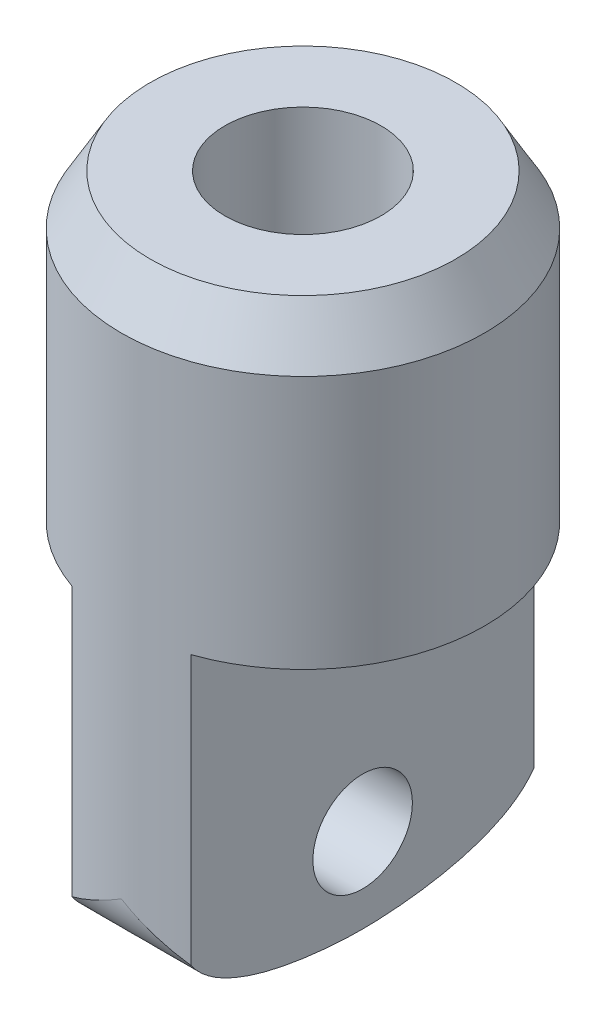
ISO-10303-21;
HEADER;
FILE_DESCRIPTION(('STEP AP214'),'2;1');
FILE_NAME('part.step','',(''),(''),'','','');
FILE_SCHEMA(('AUTOMOTIVE_DESIGN { 1 0 10303 214 1 1 1 1 }'));
ENDSEC;
DATA;
#1=APPLICATION_CONTEXT('core data for automotive mechanical design processes');
#2=APPLICATION_PROTOCOL_DEFINITION('international standard','automotive_design',2000,#1);
#3=PRODUCT_CONTEXT('',#1,'mechanical');
#4=PRODUCT('Part','Part','',(#3));
#5=PRODUCT_RELATED_PRODUCT_CATEGORY('part','',(#4));
#6=PRODUCT_DEFINITION_FORMATION('','',#4);
#7=PRODUCT_DEFINITION_CONTEXT('part definition',#1,'design');
#8=PRODUCT_DEFINITION('design','',#6,#7);
#9=PRODUCT_DEFINITION_SHAPE('','',#8);
#10=(LENGTH_UNIT() NAMED_UNIT(*) SI_UNIT(.MILLI.,.METRE.));
#11=(NAMED_UNIT(*) PLANE_ANGLE_UNIT() SI_UNIT($,.RADIAN.));
#12=(NAMED_UNIT(*) SI_UNIT($,.STERADIAN.) SOLID_ANGLE_UNIT());
#13=UNCERTAINTY_MEASURE_WITH_UNIT(LENGTH_MEASURE(1.E-05),#10,'distance_accuracy_value','');
#14=(GEOMETRIC_REPRESENTATION_CONTEXT(3) GLOBAL_UNCERTAINTY_ASSIGNED_CONTEXT((#13)) GLOBAL_UNIT_ASSIGNED_CONTEXT((#10,
#11,#12)) REPRESENTATION_CONTEXT('',''));
#15=CARTESIAN_POINT('',(0.,0.,0.));
#16=DIRECTION('',(0.,0.,1.));
#17=DIRECTION('',(1.,0.,0.));
#18=AXIS2_PLACEMENT_3D('',#15,#16,#17);
#19=CARTESIAN_POINT('',(0.,8.001,0.));
#20=DIRECTION('',(0.,-1.,0.));
#21=DIRECTION('',(0.,0.,-1.));
#22=AXIS2_PLACEMENT_3D('',#19,#20,#21);
#23=CYLINDRICAL_SURFACE('',#22,4.6355);
#24=CARTESIAN_POINT('',(0.,6.73099999999999,0.));
#25=DIRECTION('',(0.,1.,0.));
#26=DIRECTION('',(0.,0.,1.));
#27=AXIS2_PLACEMENT_3D('',#24,#25,#26);
#28=CIRCLE('',#27,4.6355);
#29=CARTESIAN_POINT('',(0.,6.73099999999999,4.6355));
#30=VERTEX_POINT('',#29);
#31=EDGE_CURVE('E11',#30,#30,#28,.F.);
#32=ORIENTED_EDGE('',*,*,#31,.T.);
#33=EDGE_LOOP('',(#32));
#34=FACE_BOUND('',#33,.T.);
#35=DIRECTION('',(0.,-1.,0.));
#36=VECTOR('',#35,1.);
#37=CARTESIAN_POINT('',(1.524,8.001,-4.37781729289837));
#38=LINE('',#37,#36);
#39=CARTESIAN_POINT('',(1.524,-6.61837688161025,-4.37781729352741));
#40=VERTEX_POINT('',#39);
#41=CARTESIAN_POINT('',(1.524,0.254000000000001,-4.37781729289837));
#42=VERTEX_POINT('',#41);
#43=EDGE_CURVE('E122',#40,#42,#38,.F.);
#44=ORIENTED_EDGE('',*,*,#43,.F.);
#45=CARTESIAN_POINT('',(1.524,-6.6183768825282,-4.37781729289837));
#46=CARTESIAN_POINT('',(1.39886984475891,-6.55481777535054,-4.4213893108293));
#47=CARTESIAN_POINT('',(1.27269817335877,-6.48948528477503,-4.45928636340324));
#48=CARTESIAN_POINT('',(1.01923114117148,-6.35551829663073,-4.52394807701265));
#49=CARTESIAN_POINT('',(0.891935629079138,-6.2868833487338,-4.55071121498339));
#50=CARTESIAN_POINT('',(0.638634508959907,-6.14735563781644,-4.59307344113135));
#51=CARTESIAN_POINT('',(0.512630337217673,-6.07649656522152,-4.60879363355244));
#52=CARTESIAN_POINT('',(0.261378439418398,-5.93206645893478,-4.62984000061978));
#53=CARTESIAN_POINT('',(0.136130336598518,-5.85849693299343,-4.63517186764435));
#54=CARTESIAN_POINT('',(0.00777879467163567,-5.78136528453976,-4.63549510986442));
#55=CARTESIAN_POINT('',(0.00388900599629693,-5.77902609438018,-4.63550000418939));
#56=CARTESIAN_POINT('',(0.,-5.77668571266033,-4.6355));
#57=B_SPLINE_CURVE_WITH_KNOTS('',3,(#45,#46,#47,#48,#49,#50,#51,#52,#53,#54,#55,#56),
.UNSPECIFIED.,.F.,.F.,(4,2,2,2,2,4),(0.,0.440703241532703,0.88146674929234,1.31731773146459,
1.75292981784377,1.76654672769661),.UNSPECIFIED.);
#58=CARTESIAN_POINT('',(0.,-5.77668571266033,-4.6355));
#59=VERTEX_POINT('',#58);
#60=EDGE_CURVE('E99',#59,#40,#57,.F.);
#61=ORIENTED_EDGE('',*,*,#60,.F.);
#62=CARTESIAN_POINT('',(-4.6355,-8.001,0.));
#63=CARTESIAN_POINT('',(-4.63550002997233,-8.00098821668318,-0.0308729861699117));
#64=CARTESIAN_POINT('',(-4.63519156359295,-8.00077492616735,-0.0617441893573759));
#65=CARTESIAN_POINT('',(-4.63395818248496,-8.00000380512682,-0.123469160017211));
#66=CARTESIAN_POINT('',(-4.63303328618186,-7.99944598490039,-0.154322927983144));
#67=CARTESIAN_POINT('',(-4.62933504957119,-7.99734358956202,-0.246832330272547));
#68=CARTESIAN_POINT('',(-4.62563816128279,-7.99537004758656,-0.308443791775957));
#69=CARTESIAN_POINT('',(-4.61579307469722,-7.99043192347579,-0.431414108068627));
#70=CARTESIAN_POINT('',(-4.60964546510313,-7.98746757937486,-0.492773019950659));
#71=CARTESIAN_POINT('',(-4.59491655189603,-7.98061246662205,-0.615143527131503));
#72=CARTESIAN_POINT('',(-4.58633519367036,-7.97672167718131,-0.67615511460511));
#73=CARTESIAN_POINT('',(-4.5570083418801,-7.96372957026418,-0.858269869076543));
#74=CARTESIAN_POINT('',(-4.53265852245257,-7.95329742059347,-0.978720868341816));
#75=CARTESIAN_POINT('',(-4.4745814253229,-7.92899284673095,-1.21697253562051));
#76=CARTESIAN_POINT('',(-4.44085371112558,-7.91512026240697,-1.33477307999228));
#77=CARTESIAN_POINT('',(-4.36437680037686,-7.88397047599407,-1.56683968765581));
#78=CARTESIAN_POINT('',(-4.32163502704745,-7.86669607612521,-1.68110857109077));
#79=CARTESIAN_POINT('',(-4.22752189805069,-7.82874254032591,-1.9054436549457));
#80=CARTESIAN_POINT('',(-4.17615071960364,-7.80806347431656,-2.01550994161654));
#81=CARTESIAN_POINT('',(-4.06526359371032,-7.76330830338415,-2.23072734760936));
#82=CARTESIAN_POINT('',(-4.00574822656297,-7.73923244048971,-2.33587881641197));
#83=CARTESIAN_POINT('',(-3.87909530200676,-7.68769140384867,-2.5406654038911));
#84=CARTESIAN_POINT('',(-3.81195490784979,-7.66022496837057,-2.64029844889861));
#85=CARTESIAN_POINT('',(-3.66873264993406,-7.60114310713387,-2.8360840641514));
#86=CARTESIAN_POINT('',(-3.5924558589522,-7.56943445026107,-2.93206589497268));
#87=CARTESIAN_POINT('',(-3.43318995182949,-7.50252865728894,-3.11704494416732));
#88=CARTESIAN_POINT('',(-3.35019838256183,-7.46733024520047,-3.20603958628449));
#89=CARTESIAN_POINT('',(-3.17828809662378,-7.39354155492171,-3.37653629947591));
#90=CARTESIAN_POINT('',(-3.08937071786207,-7.35495204173982,-3.45804005199709));
#91=CARTESIAN_POINT('',(-2.90632284104776,-7.27445873314067,-3.61324694194542));
#92=CARTESIAN_POINT('',(-2.81219040901933,-7.23255370568198,-3.68694715557273));
#93=CARTESIAN_POINT('',(-2.61455186293827,-7.14331729431488,-3.8298305178419));
#94=CARTESIAN_POINT('',(-2.51081265045017,-7.09581765373736,-3.89858619826071));
#95=CARTESIAN_POINT('',(-2.29930842338677,-6.99743055958487,-4.02695329501997));
#96=CARTESIAN_POINT('',(-2.19154188578123,-6.94654181853181,-4.08656120749163));
#97=CARTESIAN_POINT('',(-1.97285997166384,-6.84154365564578,-4.19650574676644));
#98=CARTESIAN_POINT('',(-1.86194392505536,-6.78743354570066,-4.24684038324778));
#99=CARTESIAN_POINT('',(-1.63781312869457,-6.67617578960379,-4.33821299890436));
#100=CARTESIAN_POINT('',(-1.52459767394263,-6.61902720289252,-4.37924807847482));
#101=CARTESIAN_POINT('',(-1.17943317934993,-6.44160646027334,-4.48950186480164));
#102=CARTESIAN_POINT('',(-0.945067063766445,-6.3168354465331,-4.54432971685298));
#103=CARTESIAN_POINT('',(-0.476737809800105,-6.0573148922336,-4.6169972599105));
#104=CARTESIAN_POINT('',(-0.242774700604465,-5.92258360306386,-4.63490294892768));
#105=CARTESIAN_POINT('',(-0.00777875383480484,-5.78136526431925,-4.63549511576067));
#106=CARTESIAN_POINT('',(-0.00388896512376962,-5.7790260741877,-4.63550001011139));
#107=CARTESIAN_POINT('',(0.,-5.77668571266033,-4.6355));
#108=B_SPLINE_CURVE_WITH_KNOTS('',3,(#62,#63,#64,#65,#66,#67,#68,#69,#70,#71,#72,#73,#74,#75,
#76,#77,#78,#79,#80,#81,#82,#83,#84,#85,#86,#87,#88,#89,#90,#91,#92,#93,#94,#95,#96,#97,#98,#99,
#100,#101,#102,#103,#104,#105,#106,#107),.UNSPECIFIED.,.F.,.F.,(4,2,2,2,2,2,2,2,2,2,2,2,2,2,2,2,
2,2,2,2,2,2,4),(0.,0.0926137699390076,0.185224771713524,0.370423609622515,0.555577986541659,
0.740736518602449,1.11024937264522,1.47977942858501,1.84900635067807,2.21822569096214,
2.58741873689917,2.95674958691857,3.33622379381999,3.71583726645018,4.09536531974331,
4.4750350736668,4.87423799586148,5.27359344512108,5.67303450837694,6.07259994664902,
6.8829073329111,7.69176504251056,7.70538195236524),.UNSPECIFIED.);
#109=CARTESIAN_POINT('',(-1.524,-6.61837688161025,-4.37781729352741));
#110=VERTEX_POINT('',#109);
#111=EDGE_CURVE('E92',#110,#59,#108,.T.);
#112=ORIENTED_EDGE('',*,*,#111,.F.);
#113=DIRECTION('',(0.,-1.,0.));
#114=VECTOR('',#113,1.);
#115=CARTESIAN_POINT('',(-1.524,8.001,-4.37781729289837));
#116=LINE('',#115,#114);
#117=CARTESIAN_POINT('',(-1.524,0.254000000000001,-4.37781729289837));
#118=VERTEX_POINT('',#117);
#119=EDGE_CURVE('E104',#118,#110,#116,.T.);
#120=ORIENTED_EDGE('',*,*,#119,.F.);
#121=CARTESIAN_POINT('',(0.,0.254000000000001,0.));
#122=DIRECTION('',(0.,-1.,0.));
#123=DIRECTION('',(0.,0.,-1.));
#124=AXIS2_PLACEMENT_3D('',#121,#122,#123);
#125=CIRCLE('',#124,4.6355);
#126=CARTESIAN_POINT('',(-1.524,0.254000000000001,4.37781729289837));
#127=VERTEX_POINT('',#126);
#128=EDGE_CURVE('E111',#118,#127,#125,.F.);
#129=ORIENTED_EDGE('',*,*,#128,.T.);
#130=DIRECTION('',(0.,-1.,0.));
#131=VECTOR('',#130,1.);
#132=CARTESIAN_POINT('',(-1.524,8.001,4.37781729289837));
#133=LINE('',#132,#131);
#134=CARTESIAN_POINT('',(-1.524,-6.61837688161025,4.37781729289837));
#135=VERTEX_POINT('',#134);
#136=EDGE_CURVE('E113',#127,#135,#133,.T.);
#137=ORIENTED_EDGE('',*,*,#136,.T.);
#138=CARTESIAN_POINT('',(-4.6355,-8.001,0.));
#139=CARTESIAN_POINT('',(-4.63550002997233,-8.00098821668318,0.0308729861699117));
#140=CARTESIAN_POINT('',(-4.63519156359295,-8.00077492616735,0.0617441893573759));
#141=CARTESIAN_POINT('',(-4.63395818248496,-8.00000380512682,0.123469160017211));
#142=CARTESIAN_POINT('',(-4.63303328618186,-7.99944598490039,0.154322927983144));
#143=CARTESIAN_POINT('',(-4.62933504957119,-7.99734358956202,0.246832330272547));
#144=CARTESIAN_POINT('',(-4.62563816128279,-7.99537004758656,0.308443791775957));
#145=CARTESIAN_POINT('',(-4.61579307469722,-7.99043192347579,0.431414108068627));
#146=CARTESIAN_POINT('',(-4.60964546510313,-7.98746757937486,0.492773019950659));
#147=CARTESIAN_POINT('',(-4.59491655189603,-7.98061246662205,0.615143527131503));
#148=CARTESIAN_POINT('',(-4.58633519367036,-7.97672167718131,0.67615511460511));
#149=CARTESIAN_POINT('',(-4.5570083418801,-7.96372957026418,0.858269869076543));
#150=CARTESIAN_POINT('',(-4.53265852245257,-7.95329742059347,0.978720868341816));
#151=CARTESIAN_POINT('',(-4.4745814253229,-7.92899284673095,1.21697253562051));
#152=CARTESIAN_POINT('',(-4.44085371112558,-7.91512026240697,1.33477307999228));
#153=CARTESIAN_POINT('',(-4.36437680037686,-7.88397047599407,1.56683968765581));
#154=CARTESIAN_POINT('',(-4.32163502704745,-7.86669607612521,1.68110857109077));
#155=CARTESIAN_POINT('',(-4.22752189805069,-7.82874254032591,1.9054436549457));
#156=CARTESIAN_POINT('',(-4.17615071960364,-7.80806347431656,2.01550994161654));
#157=CARTESIAN_POINT('',(-4.06526359371032,-7.76330830338415,2.23072734760936));
#158=CARTESIAN_POINT('',(-4.00574822656297,-7.73923244048971,2.33587881641197));
#159=CARTESIAN_POINT('',(-3.87909530200676,-7.68769140384867,2.5406654038911));
#160=CARTESIAN_POINT('',(-3.81195490784979,-7.66022496837057,2.64029844889861));
#161=CARTESIAN_POINT('',(-3.66873264993406,-7.60114310713387,2.8360840641514));
#162=CARTESIAN_POINT('',(-3.5924558589522,-7.56943445026107,2.93206589497268));
#163=CARTESIAN_POINT('',(-3.43318995182949,-7.50252865728894,3.11704494416732));
#164=CARTESIAN_POINT('',(-3.35019838256183,-7.46733024520047,3.20603958628449));
#165=CARTESIAN_POINT('',(-3.17828809662378,-7.39354155492171,3.37653629947591));
#166=CARTESIAN_POINT('',(-3.08937071786207,-7.35495204173982,3.45804005199709));
#167=CARTESIAN_POINT('',(-2.90632284104776,-7.27445873314067,3.61324694194542));
#168=CARTESIAN_POINT('',(-2.81219040901933,-7.23255370568198,3.68694715557273));
#169=CARTESIAN_POINT('',(-2.61455186293827,-7.14331729431488,3.8298305178419));
#170=CARTESIAN_POINT('',(-2.51081265045017,-7.09581765373736,3.89858619826071));
#171=CARTESIAN_POINT('',(-2.29930842338677,-6.99743055958487,4.02695329501997));
#172=CARTESIAN_POINT('',(-2.19154188578123,-6.94654181853181,4.08656120749163));
#173=CARTESIAN_POINT('',(-1.97285997166384,-6.84154365564578,4.19650574676644));
#174=CARTESIAN_POINT('',(-1.86194392505536,-6.78743354570066,4.24684038324778));
#175=CARTESIAN_POINT('',(-1.63781312869457,-6.67617578960379,4.33821299890436));
#176=CARTESIAN_POINT('',(-1.52459767394263,-6.61902720289252,4.37924807847482));
#177=CARTESIAN_POINT('',(-1.17943317934993,-6.44160646027334,4.48950186480164));
#178=CARTESIAN_POINT('',(-0.945067063766445,-6.3168354465331,4.54432971685298));
#179=CARTESIAN_POINT('',(-0.476737809800105,-6.0573148922336,4.6169972599105));
#180=CARTESIAN_POINT('',(-0.242774700604465,-5.92258360306386,4.63490294892768));
#181=CARTESIAN_POINT('',(-0.00777875383480484,-5.78136526431925,4.63549511576067));
#182=CARTESIAN_POINT('',(-0.00388896512376962,-5.7790260741877,4.63550001011139));
#183=CARTESIAN_POINT('',(0.,-5.77668571266033,4.6355));
#184=B_SPLINE_CURVE_WITH_KNOTS('',3,(#138,#139,#140,#141,#142,#143,#144,#145,#146,#147,#148,
#149,#150,#151,#152,#153,#154,#155,#156,#157,#158,#159,#160,#161,#162,#163,#164,#165,#166,#167,
#168,#169,#170,#171,#172,#173,#174,#175,#176,#177,#178,#179,#180,#181,#182,#183),.UNSPECIFIED.,
.F.,.F.,(4,2,2,2,2,2,2,2,2,2,2,2,2,2,2,2,2,2,2,2,2,2,4),(0.,0.0926137699390076,
0.185224771713524,0.370423609622515,0.555577986541659,0.740736518602449,1.11024937264522,
1.47977942858501,1.84900635067807,2.21822569096214,2.58741873689917,2.95674958691857,
3.33622379381999,3.71583726645018,4.09536531974331,4.4750350736668,4.87423799586148,
5.27359344512108,5.67303450837694,6.07259994664902,6.8829073329111,7.69176504251056,
7.70538195236524),.UNSPECIFIED.);
#185=CARTESIAN_POINT('',(0.,-5.77668571266033,4.6355));
#186=VERTEX_POINT('',#185);
#187=EDGE_CURVE('E49',#135,#186,#184,.T.);
#188=ORIENTED_EDGE('',*,*,#187,.T.);
#189=CARTESIAN_POINT('',(1.524,-6.6183768825282,4.37781729289837));
#190=CARTESIAN_POINT('',(1.39886984475891,-6.55481777535054,4.4213893108293));
#191=CARTESIAN_POINT('',(1.27269817335877,-6.48948528477503,4.45928636340324));
#192=CARTESIAN_POINT('',(1.01923114117148,-6.35551829663073,4.52394807701265));
#193=CARTESIAN_POINT('',(0.891935629079138,-6.2868833487338,4.55071121498339));
#194=CARTESIAN_POINT('',(0.638634508959907,-6.14735563781644,4.59307344113135));
#195=CARTESIAN_POINT('',(0.512630337217673,-6.07649656522152,4.60879363355244));
#196=CARTESIAN_POINT('',(0.261378439418398,-5.93206645893478,4.62984000061978));
#197=CARTESIAN_POINT('',(0.136130336598518,-5.85849693299343,4.63517186764435));
#198=CARTESIAN_POINT('',(0.00777879467163567,-5.78136528453976,4.63549510986442));
#199=CARTESIAN_POINT('',(0.00388900599629693,-5.77902609438018,4.63550000418939));
#200=CARTESIAN_POINT('',(0.,-5.77668571266033,4.6355));
#201=B_SPLINE_CURVE_WITH_KNOTS('',3,(#189,#190,#191,#192,#193,#194,#195,#196,#197,#198,#199,
#200),.UNSPECIFIED.,.F.,.F.,(4,2,2,2,2,4),(0.,0.440703241532703,0.88146674929234,
1.31731773146459,1.75292981784377,1.76654672769661),.UNSPECIFIED.);
#202=CARTESIAN_POINT('',(1.524,-6.61837688161025,4.37781729289837));
#203=VERTEX_POINT('',#202);
#204=EDGE_CURVE('E205',#186,#203,#201,.F.);
#205=ORIENTED_EDGE('',*,*,#204,.T.);
#206=DIRECTION('',(0.,-1.,0.));
#207=VECTOR('',#206,1.);
#208=CARTESIAN_POINT('',(1.524,8.001,4.37781729289837));
#209=LINE('',#208,#207);
#210=CARTESIAN_POINT('',(1.524,0.254000000000001,4.37781729289837));
#211=VERTEX_POINT('',#210);
#212=EDGE_CURVE('E57',#203,#211,#209,.F.);
#213=ORIENTED_EDGE('',*,*,#212,.T.);
#214=CARTESIAN_POINT('',(0.,0.254000000000001,0.));
#215=DIRECTION('',(0.,-1.,0.));
#216=DIRECTION('',(0.,0.,-1.));
#217=AXIS2_PLACEMENT_3D('',#214,#215,#216);
#218=CIRCLE('',#217,4.6355);
#219=EDGE_CURVE('E124',#211,#42,#218,.F.);
#220=ORIENTED_EDGE('',*,*,#219,.T.);
#221=EDGE_LOOP('',(#44,#61,#112,#120,#129,#137,#188,#205,#213,#220));
#222=FACE_BOUND('',#221,.T.);
#223=ADVANCED_FACE('F34',(#34,#222),#23,.T.);
#224=CARTESIAN_POINT('',(1.524,-8.001,4.6365));
#225=DIRECTION('',(1.,0.,0.));
#226=DIRECTION('',(0.,0.,-1.));
#227=AXIS2_PLACEMENT_3D('',#224,#225,#226);
#228=PLANE('',#227);
#229=CARTESIAN_POINT('',(1.524,-5.842,0.));
#230=DIRECTION('',(1.,0.,0.));
#231=DIRECTION('',(0.,0.,-1.));
#232=AXIS2_PLACEMENT_3D('',#229,#230,#231);
#233=CIRCLE('',#232,1.27);
#234=CARTESIAN_POINT('',(1.524,-5.842,-1.27));
#235=VERTEX_POINT('',#234);
#236=EDGE_CURVE('E105',#235,#235,#233,.T.);
#237=ORIENTED_EDGE('',*,*,#236,.F.);
#238=EDGE_LOOP('',(#237));
#239=FACE_BOUND('',#238,.T.);
#240=CARTESIAN_POINT('',(1.524,-5.77668571266033,-4.6355));
#241=CARTESIAN_POINT('',(1.524,-7.85156325298534,-4.6355));
#242=CARTESIAN_POINT('',(1.524,-8.001,-0.788835169669546));
#243=CARTESIAN_POINT('',(1.524,-8.001,0.));
#244=B_SPLINE_CURVE_WITH_KNOTS('',3,(#240,#241,#242,#243),.UNSPECIFIED.,.F.,.F.,(4,4),(0.,1.),.UNSPECIFIED.);
#245=CARTESIAN_POINT('',(1.524,-8.001,0.));
#246=VERTEX_POINT('',#245);
#247=EDGE_CURVE('E98',#40,#246,#244,.T.);
#248=ORIENTED_EDGE('',*,*,#247,.F.);
#249=ORIENTED_EDGE('',*,*,#43,.T.);
#250=DIRECTION('',(0.,0.,-1.));
#251=VECTOR('',#250,1.);
#252=CARTESIAN_POINT('',(1.524,0.254000000000001,4.6365));
#253=LINE('',#252,#251);
#254=EDGE_CURVE('E127',#211,#42,#253,.T.);
#255=ORIENTED_EDGE('',*,*,#254,.F.);
#256=ORIENTED_EDGE('',*,*,#212,.F.);
#257=CARTESIAN_POINT('',(1.524,-5.77668571266033,4.6355));
#258=CARTESIAN_POINT('',(1.524,-7.85156325298534,4.6355));
#259=CARTESIAN_POINT('',(1.524,-8.001,0.788835169669546));
#260=CARTESIAN_POINT('',(1.524,-8.001,0.));
#261=B_SPLINE_CURVE_WITH_KNOTS('',3,(#257,#258,#259,#260),.UNSPECIFIED.,.F.,.F.,(4,4),(0.,1.),.UNSPECIFIED.);
#262=EDGE_CURVE('E115',#203,#246,#261,.T.);
#263=ORIENTED_EDGE('',*,*,#262,.T.);
#264=EDGE_LOOP('',(#248,#249,#255,#256,#263));
#265=FACE_BOUND('',#264,.T.);
#266=ADVANCED_FACE('F157',(#239,#265),#228,.T.);
#267=CARTESIAN_POINT('',(-1.524,-8.001,4.6365));
#268=DIRECTION('',(-1.,0.,0.));
#269=DIRECTION('',(0.,0.,1.));
#270=AXIS2_PLACEMENT_3D('',#267,#268,#269);
#271=PLANE('',#270);
#272=CARTESIAN_POINT('',(-1.524,-5.842,0.));
#273=DIRECTION('',(-1.,0.,0.));
#274=DIRECTION('',(0.,0.,1.));
#275=AXIS2_PLACEMENT_3D('',#272,#273,#274);
#276=CIRCLE('',#275,1.27);
#277=CARTESIAN_POINT('',(-1.524,-5.842,-1.27));
#278=VERTEX_POINT('',#277);
#279=EDGE_CURVE('E242',#278,#278,#276,.F.);
#280=ORIENTED_EDGE('',*,*,#279,.T.);
#281=EDGE_LOOP('',(#280));
#282=FACE_BOUND('',#281,.T.);
#283=CARTESIAN_POINT('',(-1.524,-5.77668571266033,-4.6355));
#284=CARTESIAN_POINT('',(-1.524,-7.85156325298534,-4.6355));
#285=CARTESIAN_POINT('',(-1.524,-8.001,-0.788835169669546));
#286=CARTESIAN_POINT('',(-1.524,-8.001,0.));
#287=B_SPLINE_CURVE_WITH_KNOTS('',3,(#283,#284,#285,#286),.UNSPECIFIED.,.F.,.F.,(4,4),(0.,1.),.UNSPECIFIED.);
#288=CARTESIAN_POINT('',(-1.524,-8.001,0.));
#289=VERTEX_POINT('',#288);
#290=EDGE_CURVE('E89',#110,#289,#287,.T.);
#291=ORIENTED_EDGE('',*,*,#290,.T.);
#292=CARTESIAN_POINT('',(-1.524,-5.77668571266033,4.6355));
#293=CARTESIAN_POINT('',(-1.524,-7.85156325298534,4.6355));
#294=CARTESIAN_POINT('',(-1.524,-8.001,0.788835169669546));
#295=CARTESIAN_POINT('',(-1.524,-8.001,0.));
#296=B_SPLINE_CURVE_WITH_KNOTS('',3,(#292,#293,#294,#295),.UNSPECIFIED.,.F.,.F.,(4,4),(0.,1.),.UNSPECIFIED.);
#297=EDGE_CURVE('E190',#135,#289,#296,.T.);
#298=ORIENTED_EDGE('',*,*,#297,.F.);
#299=ORIENTED_EDGE('',*,*,#136,.F.);
#300=DIRECTION('',(0.,0.,-1.));
#301=VECTOR('',#300,1.);
#302=CARTESIAN_POINT('',(-1.524,0.254000000000001,4.6365));
#303=LINE('',#302,#301);
#304=EDGE_CURVE('E110',#127,#118,#303,.T.);
#305=ORIENTED_EDGE('',*,*,#304,.T.);
#306=ORIENTED_EDGE('',*,*,#119,.T.);
#307=EDGE_LOOP('',(#291,#298,#299,#305,#306));
#308=FACE_BOUND('',#307,.T.);
#309=ADVANCED_FACE('F108',(#282,#308),#271,.T.);
#310=CARTESIAN_POINT('',(0.,8.001,0.));
#311=DIRECTION('',(0.,1.,0.));
#312=DIRECTION('',(0.,0.,1.));
#313=AXIS2_PLACEMENT_3D('',#310,#311,#312);
#314=PLANE('',#313);
#315=CARTESIAN_POINT('',(0.,8.001,0.));
#316=DIRECTION('',(0.,1.,0.));
#317=DIRECTION('',(0.,0.,1.));
#318=AXIS2_PLACEMENT_3D('',#315,#316,#317);
#319=CIRCLE('',#318,3.90226515812917);
#320=CARTESIAN_POINT('',(0.,8.001,3.90226515812917));
#321=VERTEX_POINT('',#320);
#322=EDGE_CURVE('E42',#321,#321,#319,.T.);
#323=ORIENTED_EDGE('',*,*,#322,.T.);
#324=EDGE_LOOP('',(#323));
#325=FACE_BOUND('',#324,.T.);
#326=CARTESIAN_POINT('',(0.,8.001,0.));
#327=DIRECTION('',(0.,1.,0.));
#328=DIRECTION('',(0.,0.,1.));
#329=AXIS2_PLACEMENT_3D('',#326,#327,#328);
#330=CIRCLE('',#329,1.9939);
#331=CARTESIAN_POINT('',(0.,8.001,1.9939));
#332=VERTEX_POINT('',#331);
#333=EDGE_CURVE('E130',#332,#332,#330,.T.);
#334=ORIENTED_EDGE('',*,*,#333,.F.);
#335=EDGE_LOOP('',(#334));
#336=FACE_BOUND('',#335,.T.);
#337=ADVANCED_FACE('F138',(#325,#336),#314,.T.);
#338=CARTESIAN_POINT('',(0.,2.41300000000002,0.));
#339=DIRECTION('',(0.,1.,0.));
#340=DIRECTION('',(0.,0.,1.));
#341=AXIS2_PLACEMENT_3D('',#338,#339,#340);
#342=CYLINDRICAL_SURFACE('',#341,1.9939);
#343=CARTESIAN_POINT('',(0.,2.41300000000002,0.));
#344=DIRECTION('',(0.,1.,0.));
#345=DIRECTION('',(0.,0.,1.));
#346=AXIS2_PLACEMENT_3D('',#343,#344,#345);
#347=CIRCLE('',#346,1.9939);
#348=CARTESIAN_POINT('',(0.,2.41300000000002,1.9939));
#349=VERTEX_POINT('',#348);
#350=EDGE_CURVE('E131',#349,#349,#347,.T.);
#351=ORIENTED_EDGE('',*,*,#350,.F.);
#352=EDGE_LOOP('',(#351));
#353=FACE_BOUND('',#352,.T.);
#354=ORIENTED_EDGE('',*,*,#333,.T.);
#355=EDGE_LOOP('',(#354));
#356=FACE_BOUND('',#355,.T.);
#357=ADVANCED_FACE('F152',(#353,#356),#342,.F.);
#358=CARTESIAN_POINT('',(0.,2.41300000000002,0.));
#359=DIRECTION('',(0.,1.,0.));
#360=DIRECTION('',(0.,0.,1.));
#361=AXIS2_PLACEMENT_3D('',#358,#359,#360);
#362=PLANE('',#361);
#363=ORIENTED_EDGE('',*,*,#350,.T.);
#364=EDGE_LOOP('',(#363));
#365=FACE_BOUND('',#364,.T.);
#366=ADVANCED_FACE('F143',(#365),#362,.T.);
#367=CARTESIAN_POINT('',(0.,8.001,0.));
#368=DIRECTION('',(0.,-1.,0.));
#369=DIRECTION('',(0.,0.,-1.));
#370=AXIS2_PLACEMENT_3D('',#367,#368,#369);
#371=CONICAL_SURFACE('',#370,3.90226515812917,0.523598775598296);
#372=ORIENTED_EDGE('',*,*,#31,.F.);
#373=EDGE_LOOP('',(#372));
#374=FACE_BOUND('',#373,.T.);
#375=ORIENTED_EDGE('',*,*,#322,.F.);
#376=EDGE_LOOP('',(#375));
#377=FACE_BOUND('',#376,.T.);
#378=ADVANCED_FACE('F36',(#374,#377),#371,.T.);
#379=CARTESIAN_POINT('',(1.524,0.254000000000001,4.6365));
#380=DIRECTION('',(0.,-1.,0.));
#381=DIRECTION('',(0.,0.,-1.));
#382=AXIS2_PLACEMENT_3D('',#379,#380,#381);
#383=PLANE('',#382);
#384=ORIENTED_EDGE('',*,*,#254,.T.);
#385=ORIENTED_EDGE('',*,*,#219,.F.);
#386=EDGE_LOOP('',(#384,#385));
#387=FACE_BOUND('',#386,.T.);
#388=ADVANCED_FACE('F142',(#387),#383,.T.);
#389=CARTESIAN_POINT('',(-1.524,0.254000000000001,4.6365));
#390=DIRECTION('',(0.,-1.,0.));
#391=DIRECTION('',(0.,0.,-1.));
#392=AXIS2_PLACEMENT_3D('',#389,#390,#391);
#393=PLANE('',#392);
#394=ORIENTED_EDGE('',*,*,#304,.F.);
#395=ORIENTED_EDGE('',*,*,#128,.F.);
#396=EDGE_LOOP('',(#394,#395));
#397=FACE_BOUND('',#396,.T.);
#398=ADVANCED_FACE('F149',(#397),#393,.T.);
#399=CARTESIAN_POINT('',(-4.6365,-5.77668571266033,4.6355));
#400=CARTESIAN_POINT('',(-4.6365,-7.85156325298534,4.6355));
#401=CARTESIAN_POINT('',(-4.6365,-8.001,0.788835169669546));
#402=CARTESIAN_POINT('',(-4.6365,-8.001,0.));
#403=B_SPLINE_CURVE_WITH_KNOTS('',3,(#399,#400,#401,#402),.UNSPECIFIED.,.F.,.F.,(4,4),(0.,1.),.UNSPECIFIED.);
#404=DIRECTION('',(1.,0.,0.));
#405=VECTOR('',#404,1.);
#406=SURFACE_OF_LINEAR_EXTRUSION('',#403,#405);
#407=ORIENTED_EDGE('',*,*,#187,.F.);
#408=ORIENTED_EDGE('',*,*,#297,.T.);
#409=DIRECTION('',(1.,0.,0.));
#410=VECTOR('',#409,1.);
#411=CARTESIAN_POINT('',(-4.6365,-8.001,0.));
#412=LINE('',#411,#410);
#413=EDGE_CURVE('E95',#289,#246,#412,.T.);
#414=ORIENTED_EDGE('',*,*,#413,.T.);
#415=ORIENTED_EDGE('',*,*,#262,.F.);
#416=ORIENTED_EDGE('',*,*,#204,.F.);
#417=EDGE_LOOP('',(#407,#408,#414,#415,#416));
#418=FACE_BOUND('',#417,.T.);
#419=ADVANCED_FACE('F176',(#418),#406,.T.);
#420=CARTESIAN_POINT('',(-4.6365,-5.77668571266033,-4.6355));
#421=CARTESIAN_POINT('',(-4.6365,-7.85156325298534,-4.6355));
#422=CARTESIAN_POINT('',(-4.6365,-8.001,-0.788835169669546));
#423=CARTESIAN_POINT('',(-4.6365,-8.001,0.));
#424=B_SPLINE_CURVE_WITH_KNOTS('',3,(#420,#421,#422,#423),.UNSPECIFIED.,.F.,.F.,(4,4),(0.,1.),.UNSPECIFIED.);
#425=DIRECTION('',(1.,0.,0.));
#426=VECTOR('',#425,1.);
#427=SURFACE_OF_LINEAR_EXTRUSION('',#424,#426);
#428=ORIENTED_EDGE('',*,*,#60,.T.);
#429=ORIENTED_EDGE('',*,*,#247,.T.);
#430=ORIENTED_EDGE('',*,*,#413,.F.);
#431=ORIENTED_EDGE('',*,*,#290,.F.);
#432=ORIENTED_EDGE('',*,*,#111,.T.);
#433=EDGE_LOOP('',(#428,#429,#430,#431,#432));
#434=FACE_BOUND('',#433,.T.);
#435=ADVANCED_FACE('F91',(#434),#427,.F.);
#436=CARTESIAN_POINT('',(-4.6365,-5.842,0.));
#437=DIRECTION('',(1.,0.,0.));
#438=DIRECTION('',(0.,0.,-1.));
#439=AXIS2_PLACEMENT_3D('',#436,#437,#438);
#440=CYLINDRICAL_SURFACE('',#439,1.27);
#441=CARTESIAN_POINT('',(-1.524,-5.842,-1.27));
#442=CARTESIAN_POINT('',(-1.49225,-5.842,-1.27));
#443=CARTESIAN_POINT('',(-1.4605,-5.842,-1.27));
#444=CARTESIAN_POINT('',(-1.397,-5.842,-1.27));
#445=CARTESIAN_POINT('',(-1.36525,-5.842,-1.27));
#446=CARTESIAN_POINT('',(-1.30175,-5.842,-1.27));
#447=CARTESIAN_POINT('',(-1.27,-5.842,-1.27));
#448=CARTESIAN_POINT('',(-1.2065,-5.842,-1.27));
#449=CARTESIAN_POINT('',(-1.17475,-5.842,-1.27));
#450=CARTESIAN_POINT('',(-1.11125,-5.842,-1.27));
#451=CARTESIAN_POINT('',(-1.0795,-5.842,-1.27));
#452=CARTESIAN_POINT('',(-1.016,-5.842,-1.27));
#453=CARTESIAN_POINT('',(-0.984250000000001,-5.842,-1.27));
#454=CARTESIAN_POINT('',(-0.920750000000001,-5.842,-1.27));
#455=CARTESIAN_POINT('',(-0.889,-5.842,-1.27));
#456=CARTESIAN_POINT('',(-0.8255,-5.842,-1.27));
#457=CARTESIAN_POINT('',(-0.79375,-5.842,-1.27));
#458=CARTESIAN_POINT('',(-0.73025,-5.842,-1.27));
#459=CARTESIAN_POINT('',(-0.6985,-5.842,-1.27));
#460=CARTESIAN_POINT('',(-0.635000000000001,-5.842,-1.27));
#461=CARTESIAN_POINT('',(-0.603250000000001,-5.842,-1.27));
#462=CARTESIAN_POINT('',(-0.539750000000001,-5.842,-1.27));
#463=CARTESIAN_POINT('',(-0.508,-5.842,-1.27));
#464=CARTESIAN_POINT('',(-0.4445,-5.842,-1.27));
#465=CARTESIAN_POINT('',(-0.41275,-5.842,-1.27));
#466=CARTESIAN_POINT('',(-0.34925,-5.842,-1.27));
#467=CARTESIAN_POINT('',(-0.3175,-5.842,-1.27));
#468=CARTESIAN_POINT('',(-0.254000000000001,-5.842,-1.27));
#469=CARTESIAN_POINT('',(-0.222250000000001,-5.842,-1.27));
#470=CARTESIAN_POINT('',(-0.158750000000001,-5.842,-1.27));
#471=CARTESIAN_POINT('',(-0.127000000000001,-5.842,-1.27));
#472=CARTESIAN_POINT('',(-0.0635000000000008,-5.842,-1.27));
#473=CARTESIAN_POINT('',(-0.0317500000000008,-5.842,-1.27));
#474=CARTESIAN_POINT('',(0.0317499999999994,-5.842,-1.27));
#475=CARTESIAN_POINT('',(0.0634999999999996,-5.842,-1.27));
#476=CARTESIAN_POINT('',(0.127,-5.842,-1.27));
#477=CARTESIAN_POINT('',(0.15875,-5.842,-1.27));
#478=CARTESIAN_POINT('',(0.22225,-5.842,-1.27));
#479=CARTESIAN_POINT('',(0.254,-5.842,-1.27));
#480=CARTESIAN_POINT('',(0.3175,-5.842,-1.27));
#481=CARTESIAN_POINT('',(0.34925,-5.842,-1.27));
#482=CARTESIAN_POINT('',(0.41275,-5.842,-1.27));
#483=CARTESIAN_POINT('',(0.4445,-5.842,-1.27));
#484=CARTESIAN_POINT('',(0.508,-5.842,-1.27));
#485=CARTESIAN_POINT('',(0.53975,-5.842,-1.27));
#486=CARTESIAN_POINT('',(0.60325,-5.842,-1.27));
#487=CARTESIAN_POINT('',(0.635,-5.842,-1.27));
#488=CARTESIAN_POINT('',(0.6985,-5.842,-1.27));
#489=CARTESIAN_POINT('',(0.73025,-5.842,-1.27));
#490=CARTESIAN_POINT('',(0.79375,-5.842,-1.27));
#491=CARTESIAN_POINT('',(0.8255,-5.842,-1.27));
#492=CARTESIAN_POINT('',(0.888999999999999,-5.842,-1.27));
#493=CARTESIAN_POINT('',(0.920749999999999,-5.842,-1.27));
#494=CARTESIAN_POINT('',(0.98425,-5.842,-1.27));
#495=CARTESIAN_POINT('',(1.016,-5.842,-1.27));
#496=CARTESIAN_POINT('',(1.0795,-5.842,-1.27));
#497=CARTESIAN_POINT('',(1.11125,-5.842,-1.27));
#498=CARTESIAN_POINT('',(1.17475,-5.842,-1.27));
#499=CARTESIAN_POINT('',(1.2065,-5.842,-1.27));
#500=CARTESIAN_POINT('',(1.27,-5.842,-1.27));
#501=CARTESIAN_POINT('',(1.30175,-5.842,-1.27));
#502=CARTESIAN_POINT('',(1.36525,-5.842,-1.27));
#503=CARTESIAN_POINT('',(1.397,-5.842,-1.27));
#504=CARTESIAN_POINT('',(1.4605,-5.842,-1.27));
#505=CARTESIAN_POINT('',(1.49225,-5.842,-1.27));
#506=CARTESIAN_POINT('',(1.524,-5.842,-1.27));
#507=B_SPLINE_CURVE_WITH_KNOTS('',3,(#441,#442,#443,#444,#445,#446,#447,#448,#449,#450,#451,
#452,#453,#454,#455,#456,#457,#458,#459,#460,#461,#462,#463,#464,#465,#466,#467,#468,#469,#470,
#471,#472,#473,#474,#475,#476,#477,#478,#479,#480,#481,#482,#483,#484,#485,#486,#487,#488,#489,
#490,#491,#492,#493,#494,#495,#496,#497,#498,#499,#500,#501,#502,#503,#504,#505,#506),
.UNSPECIFIED.,.F.,.F.,(4,2,2,2,2,2,2,2,2,2,2,2,2,2,2,2,2,2,2,2,2,2,2,2,2,2,2,2,2,2,2,2,4),(0.,
0.0952499999999998,0.1905,0.28575,0.381,0.47625,0.5715,0.66675,0.762000000000001,0.85725,0.9525,
1.04775,1.143,1.23825,1.3335,1.42875,1.524,1.61925,1.7145,1.80975,1.905,2.00025,2.0955,2.19075,
2.286,2.38125,2.4765,2.57175,2.667,2.76225,2.8575,2.95275,3.048),.UNSPECIFIED.);
#508=EDGE_CURVE('BSEAM225',#278,#235,#507,.T.);
#509=ORIENTED_EDGE('',*,*,#279,.F.);
#510=ORIENTED_EDGE('',*,*,#236,.T.);
#511=ORIENTED_EDGE('',*,*,#508,.T.);
#512=ORIENTED_EDGE('',*,*,#508,.F.);
#513=EDGE_LOOP('',(#509,#511,#510,#512));
#514=FACE_BOUND('',#513,.T.);
#515=ADVANCED_FACE('F225',(#514),#440,.F.);
#516=CLOSED_SHELL('',(#223,#266,#309,#337,#357,#366,#378,#388,#398,#419,#435,#515));
#517=MANIFOLD_SOLID_BREP('B2',#516);
#518=ADVANCED_BREP_SHAPE_REPRESENTATION('',(#18,#517),#14);
#519=SHAPE_DEFINITION_REPRESENTATION(#9,#518);
ENDSEC;
END-ISO-10303-21;
